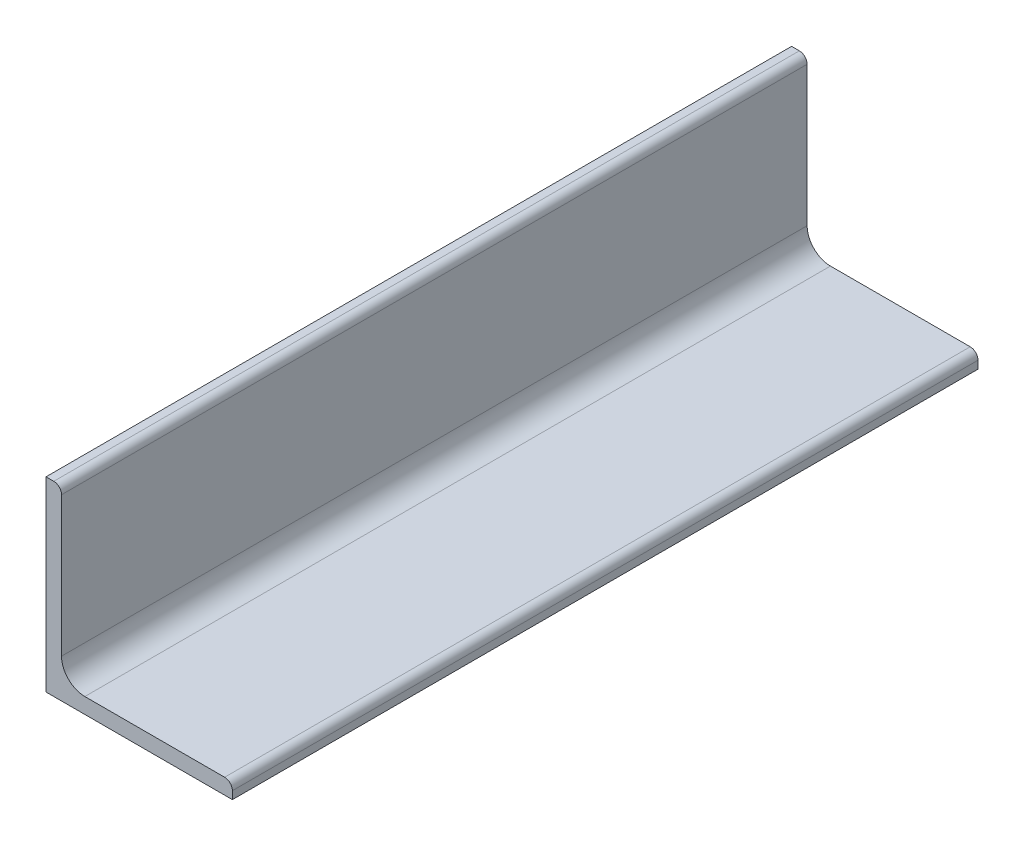
ISO-10303-21;
HEADER;
FILE_DESCRIPTION(('STEP AP214'),'2;1');
FILE_NAME('part.step','',(''),(''),'','','');
FILE_SCHEMA(('AUTOMOTIVE_DESIGN { 1 0 10303 214 1 1 1 1 }'));
ENDSEC;
DATA;
#1=APPLICATION_CONTEXT('core data for automotive mechanical design processes');
#2=APPLICATION_PROTOCOL_DEFINITION('international standard','automotive_design',2000,#1);
#3=PRODUCT_CONTEXT('',#1,'mechanical');
#4=PRODUCT('Part','Part','',(#3));
#5=PRODUCT_RELATED_PRODUCT_CATEGORY('part','',(#4));
#6=PRODUCT_DEFINITION_FORMATION('','',#4);
#7=PRODUCT_DEFINITION_CONTEXT('part definition',#1,'design');
#8=PRODUCT_DEFINITION('design','',#6,#7);
#9=PRODUCT_DEFINITION_SHAPE('','',#8);
#10=(LENGTH_UNIT() NAMED_UNIT(*) SI_UNIT(.MILLI.,.METRE.));
#11=(NAMED_UNIT(*) PLANE_ANGLE_UNIT() SI_UNIT($,.RADIAN.));
#12=(NAMED_UNIT(*) SI_UNIT($,.STERADIAN.) SOLID_ANGLE_UNIT());
#13=UNCERTAINTY_MEASURE_WITH_UNIT(LENGTH_MEASURE(1.E-05),#10,'distance_accuracy_value','');
#14=(GEOMETRIC_REPRESENTATION_CONTEXT(3) GLOBAL_UNCERTAINTY_ASSIGNED_CONTEXT((#13)) GLOBAL_UNIT_ASSIGNED_CONTEXT((#10,
#11,#12)) REPRESENTATION_CONTEXT('',''));
#15=CARTESIAN_POINT('',(0.,0.,0.));
#16=DIRECTION('',(0.,0.,1.));
#17=DIRECTION('',(1.,0.,0.));
#18=AXIS2_PLACEMENT_3D('',#15,#16,#17);
#19=CARTESIAN_POINT('',(0.490776827053332,76.2882459217981,304.8));
#20=DIRECTION('',(1.,0.,0.));
#21=DIRECTION('',(0.,0.,-1.));
#22=AXIS2_PLACEMENT_3D('',#19,#20,#21);
#23=PLANE('',#22);
#24=DIRECTION('',(0.,-1.,0.));
#25=VECTOR('',#24,1.);
#26=CARTESIAN_POINT('',(0.490776827053332,76.2882459217981,0.));
#27=LINE('',#26,#25);
#28=CARTESIAN_POINT('',(0.490776827053332,76.2882459217981,0.));
#29=VERTEX_POINT('',#28);
#30=CARTESIAN_POINT('',(0.490776827053332,0.0882459217980795,0.));
#31=VERTEX_POINT('',#30);
#32=EDGE_CURVE('E135',#29,#31,#27,.T.);
#33=ORIENTED_EDGE('',*,*,#32,.T.);
#34=DIRECTION('',(0.,0.,-1.));
#35=VECTOR('',#34,1.);
#36=CARTESIAN_POINT('',(0.490776827053332,0.0882459217980795,304.8));
#37=LINE('',#36,#35);
#38=CARTESIAN_POINT('',(0.490776827053332,0.0882459217980795,304.8));
#39=VERTEX_POINT('',#38);
#40=EDGE_CURVE('E11',#39,#31,#37,.T.);
#41=ORIENTED_EDGE('',*,*,#40,.F.);
#42=DIRECTION('',(0.,-1.,0.));
#43=VECTOR('',#42,1.);
#44=CARTESIAN_POINT('',(0.490776827053332,76.2882459217981,304.8));
#45=LINE('',#44,#43);
#46=CARTESIAN_POINT('',(0.490776827053332,76.2882459217981,304.8));
#47=VERTEX_POINT('',#46);
#48=EDGE_CURVE('E151',#47,#39,#45,.T.);
#49=ORIENTED_EDGE('',*,*,#48,.F.);
#50=DIRECTION('',(0.,0.,-1.));
#51=VECTOR('',#50,1.);
#52=CARTESIAN_POINT('',(0.490776827053332,76.2882459217981,304.8));
#53=LINE('',#52,#51);
#54=EDGE_CURVE('E131',#47,#29,#53,.T.);
#55=ORIENTED_EDGE('',*,*,#54,.T.);
#56=EDGE_LOOP('',(#33,#41,#49,#55));
#57=FACE_BOUND('',#56,.T.);
#58=ADVANCED_FACE('F33',(#57),#23,.F.);
#59=CARTESIAN_POINT('',(0.490776827053332,0.0882459217980795,304.8));
#60=DIRECTION('',(0.,1.,0.));
#61=DIRECTION('',(0.,0.,1.));
#62=AXIS2_PLACEMENT_3D('',#59,#60,#61);
#63=PLANE('',#62);
#64=DIRECTION('',(1.,0.,0.));
#65=VECTOR('',#64,1.);
#66=CARTESIAN_POINT('',(0.490776827053332,0.0882459217980795,0.));
#67=LINE('',#66,#65);
#68=CARTESIAN_POINT('',(76.6907768270533,0.0882459217980795,0.));
#69=VERTEX_POINT('',#68);
#70=EDGE_CURVE('E138',#31,#69,#67,.T.);
#71=ORIENTED_EDGE('',*,*,#70,.T.);
#72=DIRECTION('',(0.,0.,-1.));
#73=VECTOR('',#72,1.);
#74=CARTESIAN_POINT('',(76.6907768270533,0.0882459217980795,304.8));
#75=LINE('',#74,#73);
#76=CARTESIAN_POINT('',(76.6907768270533,0.0882459217980795,304.8));
#77=VERTEX_POINT('',#76);
#78=EDGE_CURVE('E41',#77,#69,#75,.T.);
#79=ORIENTED_EDGE('',*,*,#78,.F.);
#80=DIRECTION('',(1.,0.,0.));
#81=VECTOR('',#80,1.);
#82=CARTESIAN_POINT('',(0.490776827053332,0.0882459217980795,304.8));
#83=LINE('',#82,#81);
#84=EDGE_CURVE('E95',#39,#77,#83,.T.);
#85=ORIENTED_EDGE('',*,*,#84,.F.);
#86=ORIENTED_EDGE('',*,*,#40,.T.);
#87=EDGE_LOOP('',(#71,#79,#85,#86));
#88=FACE_BOUND('',#87,.T.);
#89=ADVANCED_FACE('F194',(#88),#63,.F.);
#90=CARTESIAN_POINT('',(76.6907768270533,0.0882459217980795,304.8));
#91=DIRECTION('',(-1.,0.,0.));
#92=DIRECTION('',(0.,0.,1.));
#93=AXIS2_PLACEMENT_3D('',#90,#91,#92);
#94=PLANE('',#93);
#95=DIRECTION('',(0.,1.,0.));
#96=VECTOR('',#95,1.);
#97=CARTESIAN_POINT('',(76.6907768270533,0.0882459217980795,0.));
#98=LINE('',#97,#96);
#99=CARTESIAN_POINT('',(76.6907768270533,3.26324592179808,0.));
#100=VERTEX_POINT('',#99);
#101=EDGE_CURVE('E140',#69,#100,#98,.T.);
#102=ORIENTED_EDGE('',*,*,#101,.T.);
#103=DIRECTION('',(0.,0.,-1.));
#104=VECTOR('',#103,1.);
#105=CARTESIAN_POINT('',(76.6907768270533,3.26324592179808,304.8));
#106=LINE('',#105,#104);
#107=CARTESIAN_POINT('',(76.6907768270533,3.26324592179808,304.8));
#108=VERTEX_POINT('',#107);
#109=EDGE_CURVE('E161',#108,#100,#106,.T.);
#110=ORIENTED_EDGE('',*,*,#109,.F.);
#111=DIRECTION('',(0.,1.,0.));
#112=VECTOR('',#111,1.);
#113=CARTESIAN_POINT('',(76.6907768270533,0.0882459217980795,304.8));
#114=LINE('',#113,#112);
#115=EDGE_CURVE('E169',#77,#108,#114,.T.);
#116=ORIENTED_EDGE('',*,*,#115,.F.);
#117=ORIENTED_EDGE('',*,*,#78,.T.);
#118=EDGE_LOOP('',(#102,#110,#116,#117));
#119=FACE_BOUND('',#118,.T.);
#120=ADVANCED_FACE('F167',(#119),#94,.F.);
#121=CARTESIAN_POINT('',(73.5157768270533,3.26324592179808,304.8));
#122=DIRECTION('',(0.,0.,-1.));
#123=DIRECTION('',(-1.,0.,0.));
#124=AXIS2_PLACEMENT_3D('',#121,#122,#123);
#125=CYLINDRICAL_SURFACE('',#124,3.175);
#126=CARTESIAN_POINT('',(73.5157768270533,3.26324592179808,0.));
#127=DIRECTION('',(0.,0.,1.));
#128=DIRECTION('',(1.,0.,0.));
#129=AXIS2_PLACEMENT_3D('',#126,#127,#128);
#130=CIRCLE('',#129,3.175);
#131=CARTESIAN_POINT('',(73.5157768270533,6.43824592179808,0.));
#132=VERTEX_POINT('',#131);
#133=EDGE_CURVE('E142',#100,#132,#130,.T.);
#134=ORIENTED_EDGE('',*,*,#133,.T.);
#135=DIRECTION('',(0.,0.,-1.));
#136=VECTOR('',#135,1.);
#137=CARTESIAN_POINT('',(73.5157768270533,6.43824592179808,304.8));
#138=LINE('',#137,#136);
#139=CARTESIAN_POINT('',(73.5157768270533,6.43824592179808,304.8));
#140=VERTEX_POINT('',#139);
#141=EDGE_CURVE('E158',#140,#132,#138,.T.);
#142=ORIENTED_EDGE('',*,*,#141,.F.);
#143=CARTESIAN_POINT('',(73.5157768270533,3.26324592179808,304.8));
#144=DIRECTION('',(0.,0.,1.));
#145=DIRECTION('',(1.,0.,0.));
#146=AXIS2_PLACEMENT_3D('',#143,#144,#145);
#147=CIRCLE('',#146,3.175);
#148=EDGE_CURVE('E185',#108,#140,#147,.T.);
#149=ORIENTED_EDGE('',*,*,#148,.F.);
#150=ORIENTED_EDGE('',*,*,#109,.T.);
#151=EDGE_LOOP('',(#134,#142,#149,#150));
#152=FACE_BOUND('',#151,.T.);
#153=ADVANCED_FACE('F178',(#152),#125,.T.);
#154=CARTESIAN_POINT('',(73.5157768270533,6.43824592179808,304.8));
#155=DIRECTION('',(0.,-1.,0.));
#156=DIRECTION('',(0.,0.,-1.));
#157=AXIS2_PLACEMENT_3D('',#154,#155,#156);
#158=PLANE('',#157);
#159=DIRECTION('',(-1.,0.,0.));
#160=VECTOR('',#159,1.);
#161=CARTESIAN_POINT('',(73.5157768270533,6.43824592179808,0.));
#162=LINE('',#161,#160);
#163=CARTESIAN_POINT('',(16.3657768270533,6.43824592179808,0.));
#164=VERTEX_POINT('',#163);
#165=EDGE_CURVE('E144',#132,#164,#162,.T.);
#166=ORIENTED_EDGE('',*,*,#165,.T.);
#167=DIRECTION('',(0.,0.,-1.));
#168=VECTOR('',#167,1.);
#169=CARTESIAN_POINT('',(16.3657768270533,6.43824592179808,304.8));
#170=LINE('',#169,#168);
#171=CARTESIAN_POINT('',(16.3657768270533,6.43824592179808,304.8));
#172=VERTEX_POINT('',#171);
#173=EDGE_CURVE('E155',#172,#164,#170,.T.);
#174=ORIENTED_EDGE('',*,*,#173,.F.);
#175=DIRECTION('',(-1.,0.,0.));
#176=VECTOR('',#175,1.);
#177=CARTESIAN_POINT('',(73.5157768270533,6.43824592179808,304.8));
#178=LINE('',#177,#176);
#179=EDGE_CURVE('E184',#140,#172,#178,.T.);
#180=ORIENTED_EDGE('',*,*,#179,.F.);
#181=ORIENTED_EDGE('',*,*,#141,.T.);
#182=EDGE_LOOP('',(#166,#174,#180,#181));
#183=FACE_BOUND('',#182,.T.);
#184=ADVANCED_FACE('F182',(#183),#158,.F.);
#185=CARTESIAN_POINT('',(16.3657768270533,15.9632459217981,304.8));
#186=DIRECTION('',(0.,0.,-1.));
#187=DIRECTION('',(-1.,0.,0.));
#188=AXIS2_PLACEMENT_3D('',#185,#186,#187);
#189=CYLINDRICAL_SURFACE('',#188,9.52499999999999);
#190=CARTESIAN_POINT('',(16.3657768270533,15.9632459217981,0.));
#191=DIRECTION('',(0.,0.,-1.));
#192=DIRECTION('',(1.,0.,0.));
#193=AXIS2_PLACEMENT_3D('',#190,#191,#192);
#194=CIRCLE('',#193,9.52499999999999);
#195=CARTESIAN_POINT('',(6.84077682705333,15.9632459217981,0.));
#196=VERTEX_POINT('',#195);
#197=EDGE_CURVE('E146',#164,#196,#194,.T.);
#198=ORIENTED_EDGE('',*,*,#197,.T.);
#199=DIRECTION('',(0.,0.,-1.));
#200=VECTOR('',#199,1.);
#201=CARTESIAN_POINT('',(6.84077682705333,15.9632459217981,304.8));
#202=LINE('',#201,#200);
#203=CARTESIAN_POINT('',(6.84077682705333,15.9632459217981,304.8));
#204=VERTEX_POINT('',#203);
#205=EDGE_CURVE('E126',#204,#196,#202,.T.);
#206=ORIENTED_EDGE('',*,*,#205,.F.);
#207=CARTESIAN_POINT('',(16.3657768270533,15.9632459217981,304.8));
#208=DIRECTION('',(0.,0.,-1.));
#209=DIRECTION('',(1.,0.,0.));
#210=AXIS2_PLACEMENT_3D('',#207,#208,#209);
#211=CIRCLE('',#210,9.52499999999999);
#212=EDGE_CURVE('E117',#172,#204,#211,.T.);
#213=ORIENTED_EDGE('',*,*,#212,.F.);
#214=ORIENTED_EDGE('',*,*,#173,.T.);
#215=EDGE_LOOP('',(#198,#206,#213,#214));
#216=FACE_BOUND('',#215,.T.);
#217=ADVANCED_FACE('F206',(#216),#189,.F.);
#218=CARTESIAN_POINT('',(6.84077682705333,15.9632459217981,304.8));
#219=DIRECTION('',(-1.,0.,0.));
#220=DIRECTION('',(0.,0.,1.));
#221=AXIS2_PLACEMENT_3D('',#218,#219,#220);
#222=PLANE('',#221);
#223=DIRECTION('',(0.,1.,0.));
#224=VECTOR('',#223,1.);
#225=CARTESIAN_POINT('',(6.84077682705333,15.9632459217981,0.));
#226=LINE('',#225,#224);
#227=CARTESIAN_POINT('',(6.84077682705333,73.1132459217981,0.));
#228=VERTEX_POINT('',#227);
#229=EDGE_CURVE('E125',#196,#228,#226,.T.);
#230=ORIENTED_EDGE('',*,*,#229,.T.);
#231=DIRECTION('',(0.,0.,-1.));
#232=VECTOR('',#231,1.);
#233=CARTESIAN_POINT('',(6.84077682705333,73.1132459217981,304.8));
#234=LINE('',#233,#232);
#235=CARTESIAN_POINT('',(6.84077682705333,73.1132459217981,304.8));
#236=VERTEX_POINT('',#235);
#237=EDGE_CURVE('E122',#236,#228,#234,.T.);
#238=ORIENTED_EDGE('',*,*,#237,.F.);
#239=DIRECTION('',(0.,1.,0.));
#240=VECTOR('',#239,1.);
#241=CARTESIAN_POINT('',(6.84077682705333,15.9632459217981,304.8));
#242=LINE('',#241,#240);
#243=EDGE_CURVE('E111',#204,#236,#242,.T.);
#244=ORIENTED_EDGE('',*,*,#243,.F.);
#245=ORIENTED_EDGE('',*,*,#205,.T.);
#246=EDGE_LOOP('',(#230,#238,#244,#245));
#247=FACE_BOUND('',#246,.T.);
#248=ADVANCED_FACE('F123',(#247),#222,.F.);
#249=CARTESIAN_POINT('',(3.66577682705333,73.1132459217981,304.8));
#250=DIRECTION('',(0.,0.,-1.));
#251=DIRECTION('',(-1.,0.,0.));
#252=AXIS2_PLACEMENT_3D('',#249,#250,#251);
#253=CYLINDRICAL_SURFACE('',#252,3.175);
#254=CARTESIAN_POINT('',(3.66577682705333,73.1132459217981,0.));
#255=DIRECTION('',(0.,0.,1.));
#256=DIRECTION('',(1.,0.,0.));
#257=AXIS2_PLACEMENT_3D('',#254,#255,#256);
#258=CIRCLE('',#257,3.175);
#259=CARTESIAN_POINT('',(3.66577682705333,76.2882459217981,0.));
#260=VERTEX_POINT('',#259);
#261=EDGE_CURVE('E81',#228,#260,#258,.T.);
#262=ORIENTED_EDGE('',*,*,#261,.T.);
#263=DIRECTION('',(0.,0.,-1.));
#264=VECTOR('',#263,1.);
#265=CARTESIAN_POINT('',(3.66577682705333,76.2882459217981,304.8));
#266=LINE('',#265,#264);
#267=CARTESIAN_POINT('',(3.66577682705333,76.2882459217981,304.8));
#268=VERTEX_POINT('',#267);
#269=EDGE_CURVE('E127',#268,#260,#266,.T.);
#270=ORIENTED_EDGE('',*,*,#269,.F.);
#271=CARTESIAN_POINT('',(3.66577682705333,73.1132459217981,304.8));
#272=DIRECTION('',(0.,0.,1.));
#273=DIRECTION('',(1.,0.,0.));
#274=AXIS2_PLACEMENT_3D('',#271,#272,#273);
#275=CIRCLE('',#274,3.175);
#276=EDGE_CURVE('E115',#236,#268,#275,.T.);
#277=ORIENTED_EDGE('',*,*,#276,.F.);
#278=ORIENTED_EDGE('',*,*,#237,.T.);
#279=EDGE_LOOP('',(#262,#270,#277,#278));
#280=FACE_BOUND('',#279,.T.);
#281=ADVANCED_FACE('F129',(#280),#253,.T.);
#282=CARTESIAN_POINT('',(3.66577682705333,76.2882459217981,304.8));
#283=DIRECTION('',(0.,-1.,0.));
#284=DIRECTION('',(0.,0.,-1.));
#285=AXIS2_PLACEMENT_3D('',#282,#283,#284);
#286=PLANE('',#285);
#287=DIRECTION('',(-1.,0.,0.));
#288=VECTOR('',#287,1.);
#289=CARTESIAN_POINT('',(3.66577682705333,76.2882459217981,0.));
#290=LINE('',#289,#288);
#291=EDGE_CURVE('E87',#260,#29,#290,.T.);
#292=ORIENTED_EDGE('',*,*,#291,.T.);
#293=ORIENTED_EDGE('',*,*,#54,.F.);
#294=DIRECTION('',(-1.,0.,0.));
#295=VECTOR('',#294,1.);
#296=CARTESIAN_POINT('',(3.66577682705333,76.2882459217981,304.8));
#297=LINE('',#296,#295);
#298=EDGE_CURVE('E49',#268,#47,#297,.T.);
#299=ORIENTED_EDGE('',*,*,#298,.F.);
#300=ORIENTED_EDGE('',*,*,#269,.T.);
#301=EDGE_LOOP('',(#292,#293,#299,#300));
#302=FACE_BOUND('',#301,.T.);
#303=ADVANCED_FACE('F214',(#302),#286,.F.);
#304=CARTESIAN_POINT('',(73.5157768270533,3.26324592179808,304.8));
#305=DIRECTION('',(0.,0.,1.));
#306=DIRECTION('',(1.,0.,0.));
#307=AXIS2_PLACEMENT_3D('',#304,#305,#306);
#308=PLANE('',#307);
#309=ORIENTED_EDGE('',*,*,#48,.T.);
#310=ORIENTED_EDGE('',*,*,#84,.T.);
#311=ORIENTED_EDGE('',*,*,#115,.T.);
#312=ORIENTED_EDGE('',*,*,#148,.T.);
#313=ORIENTED_EDGE('',*,*,#179,.T.);
#314=ORIENTED_EDGE('',*,*,#212,.T.);
#315=ORIENTED_EDGE('',*,*,#243,.T.);
#316=ORIENTED_EDGE('',*,*,#276,.T.);
#317=ORIENTED_EDGE('',*,*,#298,.T.);
#318=EDGE_LOOP('',(#309,#310,#311,#312,#313,#314,#315,#316,#317));
#319=FACE_BOUND('',#318,.T.);
#320=ADVANCED_FACE('F113',(#319),#308,.T.);
#321=CARTESIAN_POINT('',(73.5157768270533,3.26324592179808,0.));
#322=DIRECTION('',(0.,0.,1.));
#323=DIRECTION('',(1.,0.,0.));
#324=AXIS2_PLACEMENT_3D('',#321,#322,#323);
#325=PLANE('',#324);
#326=ORIENTED_EDGE('',*,*,#32,.F.);
#327=ORIENTED_EDGE('',*,*,#291,.F.);
#328=ORIENTED_EDGE('',*,*,#261,.F.);
#329=ORIENTED_EDGE('',*,*,#229,.F.);
#330=ORIENTED_EDGE('',*,*,#197,.F.);
#331=ORIENTED_EDGE('',*,*,#165,.F.);
#332=ORIENTED_EDGE('',*,*,#133,.F.);
#333=ORIENTED_EDGE('',*,*,#101,.F.);
#334=ORIENTED_EDGE('',*,*,#70,.F.);
#335=EDGE_LOOP('',(#326,#327,#328,#329,#330,#331,#332,#333,#334));
#336=FACE_BOUND('',#335,.T.);
#337=ADVANCED_FACE('F173',(#336),#325,.F.);
#338=CLOSED_SHELL('',(#58,#89,#120,#153,#184,#217,#248,#281,#303,#320,#337));
#339=MANIFOLD_SOLID_BREP('B2',#338);
#340=ADVANCED_BREP_SHAPE_REPRESENTATION('',(#18,#339),#14);
#341=SHAPE_DEFINITION_REPRESENTATION(#9,#340);
ENDSEC;
END-ISO-10303-21;
